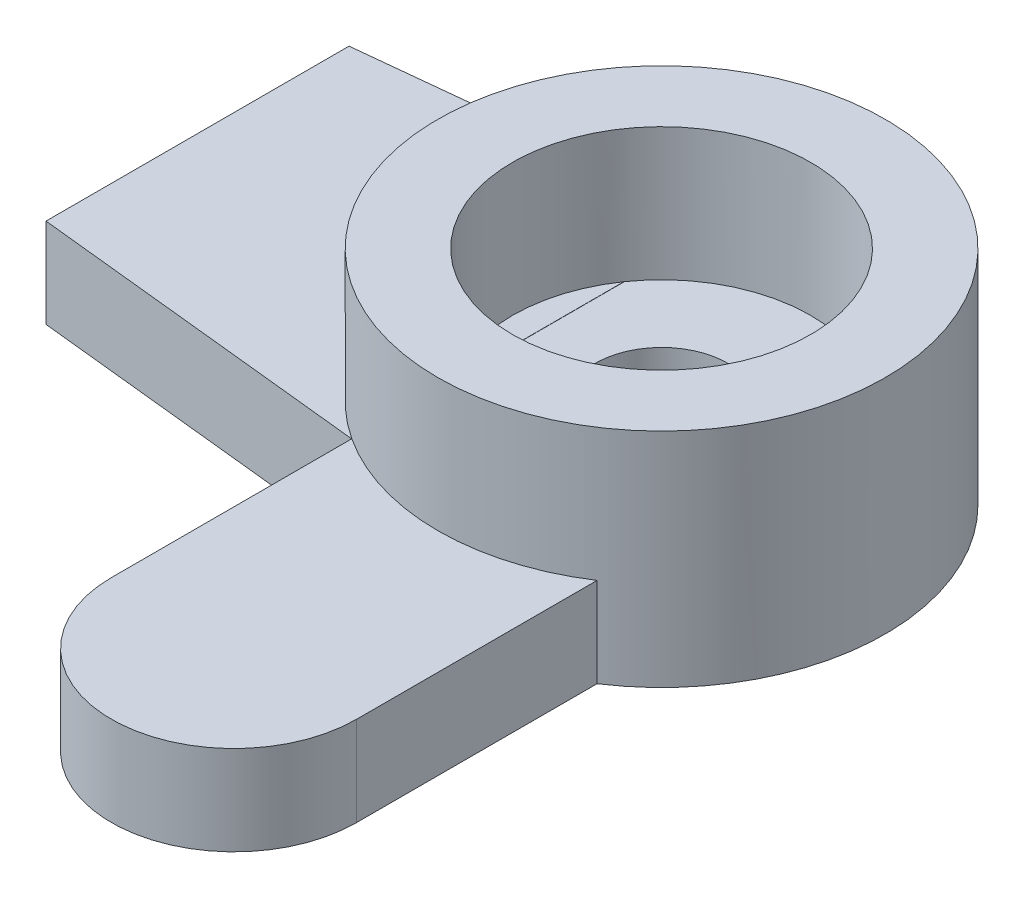
ISO-10303-21;
HEADER;
FILE_DESCRIPTION(('STEP AP214'),'2;1');
FILE_NAME('part.step','',(''),(''),'','','');
FILE_SCHEMA(('AUTOMOTIVE_DESIGN { 1 0 10303 214 1 1 1 1 }'));
ENDSEC;
DATA;
#1=APPLICATION_CONTEXT('core data for automotive mechanical design processes');
#2=APPLICATION_PROTOCOL_DEFINITION('international standard','automotive_design',2000,#1);
#3=PRODUCT_CONTEXT('',#1,'mechanical');
#4=PRODUCT('Part','Part','',(#3));
#5=PRODUCT_RELATED_PRODUCT_CATEGORY('part','',(#4));
#6=PRODUCT_DEFINITION_FORMATION('','',#4);
#7=PRODUCT_DEFINITION_CONTEXT('part definition',#1,'design');
#8=PRODUCT_DEFINITION('design','',#6,#7);
#9=PRODUCT_DEFINITION_SHAPE('','',#8);
#10=(LENGTH_UNIT() NAMED_UNIT(*) SI_UNIT(.MILLI.,.METRE.));
#11=(NAMED_UNIT(*) PLANE_ANGLE_UNIT() SI_UNIT($,.RADIAN.));
#12=(NAMED_UNIT(*) SI_UNIT($,.STERADIAN.) SOLID_ANGLE_UNIT());
#13=UNCERTAINTY_MEASURE_WITH_UNIT(LENGTH_MEASURE(1.E-05),#10,'distance_accuracy_value','');
#14=(GEOMETRIC_REPRESENTATION_CONTEXT(3) GLOBAL_UNCERTAINTY_ASSIGNED_CONTEXT((#13)) GLOBAL_UNIT_ASSIGNED_CONTEXT((#10,
#11,#12)) REPRESENTATION_CONTEXT('',''));
#15=CARTESIAN_POINT('',(0.,0.,0.));
#16=DIRECTION('',(0.,0.,1.));
#17=DIRECTION('',(1.,0.,0.));
#18=AXIS2_PLACEMENT_3D('',#15,#16,#17);
#19=CARTESIAN_POINT('',(-0.312640586171714,1.35,2.98563064108722));
#20=DIRECTION('',(-0.10414565677559,0.,0.994562055467018));
#21=DIRECTION('',(0.994562055467019,0.,0.10414565677559));
#22=AXIS2_PLACEMENT_3D('',#19,#20,#21);
#23=PLANE('',#22);
#24=DIRECTION('',(-0.994562055467019,0.,-0.10414565677559));
#25=VECTOR('',#24,1.);
#26=CARTESIAN_POINT('',(-0.312640586171714,0.,2.98563064108722));
#27=LINE('',#26,#25);
#28=CARTESIAN_POINT('',(-1.85,0.,2.82464590919123));
#29=VERTEX_POINT('',#28);
#30=CARTESIAN_POINT('',(-7.,0.,2.28536318726753));
#31=VERTEX_POINT('',#30);
#32=EDGE_CURVE('E139',#29,#31,#27,.T.);
#33=ORIENTED_EDGE('',*,*,#32,.F.);
#34=DIRECTION('',(0.,-1.,0.));
#35=VECTOR('',#34,1.);
#36=CARTESIAN_POINT('',(-1.85,1.35,2.82464590919123));
#37=LINE('',#36,#35);
#38=CARTESIAN_POINT('',(-1.85,1.35,2.82464590919123));
#39=VERTEX_POINT('',#38);
#40=EDGE_CURVE('E13',#39,#29,#37,.T.);
#41=ORIENTED_EDGE('',*,*,#40,.F.);
#42=DIRECTION('',(-0.994562055467019,0.,-0.10414565677559));
#43=VECTOR('',#42,1.);
#44=CARTESIAN_POINT('',(-0.312640586171714,1.35,2.98563064108722));
#45=LINE('',#44,#43);
#46=CARTESIAN_POINT('',(-7.,1.35,2.28536318726753));
#47=VERTEX_POINT('',#46);
#48=EDGE_CURVE('E124',#39,#47,#45,.T.);
#49=ORIENTED_EDGE('',*,*,#48,.T.);
#50=DIRECTION('',(0.,-1.,0.));
#51=VECTOR('',#50,1.);
#52=CARTESIAN_POINT('',(-7.,1.35,2.28536318726753));
#53=LINE('',#52,#51);
#54=EDGE_CURVE('E92',#47,#31,#53,.T.);
#55=ORIENTED_EDGE('',*,*,#54,.T.);
#56=EDGE_LOOP('',(#33,#41,#49,#55));
#57=FACE_BOUND('',#56,.T.);
#58=ADVANCED_FACE('F76',(#57),#23,.T.);
#59=CARTESIAN_POINT('',(-1.85,1.35,0.));
#60=DIRECTION('',(-1.,0.,0.));
#61=DIRECTION('',(0.,0.,1.));
#62=AXIS2_PLACEMENT_3D('',#59,#60,#61);
#63=PLANE('',#62);
#64=DIRECTION('',(0.,0.,-1.));
#65=VECTOR('',#64,1.);
#66=CARTESIAN_POINT('',(-1.85,0.,0.));
#67=LINE('',#66,#65);
#68=CARTESIAN_POINT('',(-1.85,0.,-2.82464590919123));
#69=VERTEX_POINT('',#68);
#70=EDGE_CURVE('E130',#29,#69,#67,.T.);
#71=ORIENTED_EDGE('',*,*,#70,.T.);
#72=DIRECTION('',(0.,-1.,0.));
#73=VECTOR('',#72,1.);
#74=CARTESIAN_POINT('',(-1.85,1.35,-2.82464590919123));
#75=LINE('',#74,#73);
#76=CARTESIAN_POINT('',(-1.85,1.35,-2.82464590919123));
#77=VERTEX_POINT('',#76);
#78=EDGE_CURVE('E84',#77,#69,#75,.T.);
#79=ORIENTED_EDGE('',*,*,#78,.F.);
#80=DIRECTION('',(0.,0.,-1.));
#81=VECTOR('',#80,1.);
#82=CARTESIAN_POINT('',(-1.85,1.35,0.));
#83=LINE('',#82,#81);
#84=EDGE_CURVE('E118',#39,#77,#83,.T.);
#85=ORIENTED_EDGE('',*,*,#84,.F.);
#86=ORIENTED_EDGE('',*,*,#40,.T.);
#87=EDGE_LOOP('',(#71,#79,#85,#86));
#88=FACE_BOUND('',#87,.T.);
#89=ADVANCED_FACE('F128',(#88),#63,.F.);
#90=CARTESIAN_POINT('',(-0.312640586171714,1.35,-2.98563064108722));
#91=DIRECTION('',(0.10414565677559,0.,0.994562055467018));
#92=DIRECTION('',(0.994562055467019,0.,-0.10414565677559));
#93=AXIS2_PLACEMENT_3D('',#90,#91,#92);
#94=PLANE('',#93);
#95=DIRECTION('',(-0.994562055467019,0.,0.10414565677559));
#96=VECTOR('',#95,1.);
#97=CARTESIAN_POINT('',(-0.312640586171714,0.,-2.98563064108722));
#98=LINE('',#97,#96);
#99=CARTESIAN_POINT('',(-7.,0.,-2.28536318726753));
#100=VERTEX_POINT('',#99);
#101=EDGE_CURVE('E142',#69,#100,#98,.T.);
#102=ORIENTED_EDGE('',*,*,#101,.T.);
#103=DIRECTION('',(0.,-1.,0.));
#104=VECTOR('',#103,1.);
#105=CARTESIAN_POINT('',(-7.,1.35,-2.28536318726753));
#106=LINE('',#105,#104);
#107=CARTESIAN_POINT('',(-7.,1.35,-2.28536318726753));
#108=VERTEX_POINT('',#107);
#109=EDGE_CURVE('E106',#108,#100,#106,.T.);
#110=ORIENTED_EDGE('',*,*,#109,.F.);
#111=DIRECTION('',(-0.994562055467019,0.,0.10414565677559));
#112=VECTOR('',#111,1.);
#113=CARTESIAN_POINT('',(-0.312640586171714,1.35,-2.98563064108722));
#114=LINE('',#113,#112);
#115=EDGE_CURVE('E123',#77,#108,#114,.T.);
#116=ORIENTED_EDGE('',*,*,#115,.F.);
#117=ORIENTED_EDGE('',*,*,#78,.T.);
#118=EDGE_LOOP('',(#102,#110,#116,#117));
#119=FACE_BOUND('',#118,.T.);
#120=ADVANCED_FACE('F133',(#119),#94,.F.);
#121=CARTESIAN_POINT('',(-7.,1.35,0.));
#122=DIRECTION('',(-1.,0.,0.));
#123=DIRECTION('',(0.,0.,1.));
#124=AXIS2_PLACEMENT_3D('',#121,#122,#123);
#125=PLANE('',#124);
#126=DIRECTION('',(0.,0.,-1.));
#127=VECTOR('',#126,1.);
#128=CARTESIAN_POINT('',(-7.,0.,0.));
#129=LINE('',#128,#127);
#130=EDGE_CURVE('E144',#31,#100,#129,.T.);
#131=ORIENTED_EDGE('',*,*,#130,.F.);
#132=ORIENTED_EDGE('',*,*,#54,.F.);
#133=DIRECTION('',(0.,0.,-1.));
#134=VECTOR('',#133,1.);
#135=CARTESIAN_POINT('',(-7.,1.35,0.));
#136=LINE('',#135,#134);
#137=EDGE_CURVE('E134',#47,#108,#136,.T.);
#138=ORIENTED_EDGE('',*,*,#137,.T.);
#139=ORIENTED_EDGE('',*,*,#109,.T.);
#140=EDGE_LOOP('',(#131,#132,#138,#139));
#141=FACE_BOUND('',#140,.T.);
#142=ADVANCED_FACE('F149',(#141),#125,.T.);
#143=CARTESIAN_POINT('',(0.,1.35,0.));
#144=DIRECTION('',(0.,1.,0.));
#145=DIRECTION('',(0.,0.,1.));
#146=AXIS2_PLACEMENT_3D('',#143,#144,#145);
#147=PLANE('',#146);
#148=ORIENTED_EDGE('',*,*,#48,.F.);
#149=ORIENTED_EDGE('',*,*,#84,.T.);
#150=ORIENTED_EDGE('',*,*,#115,.T.);
#151=ORIENTED_EDGE('',*,*,#137,.F.);
#152=EDGE_LOOP('',(#148,#149,#150,#151));
#153=FACE_BOUND('',#152,.T.);
#154=ADVANCED_FACE('F120',(#153),#147,.T.);
#155=CARTESIAN_POINT('',(0.,0.,0.));
#156=DIRECTION('',(0.,1.,0.));
#157=DIRECTION('',(0.,0.,1.));
#158=AXIS2_PLACEMENT_3D('',#155,#156,#157);
#159=PLANE('',#158);
#160=ORIENTED_EDGE('',*,*,#32,.T.);
#161=ORIENTED_EDGE('',*,*,#130,.T.);
#162=ORIENTED_EDGE('',*,*,#101,.F.);
#163=ORIENTED_EDGE('',*,*,#70,.F.);
#164=EDGE_LOOP('',(#160,#161,#162,#163));
#165=FACE_BOUND('',#164,.T.);
#166=ADVANCED_FACE('F156',(#165),#159,.F.);
#167=CLOSED_SHELL('',(#58,#89,#120,#142,#154,#166));
#168=MANIFOLD_SOLID_BREP('B2',#167);
#169=CARTESIAN_POINT('',(1.85,1.35,0.));
#170=DIRECTION('',(-1.,0.,0.));
#171=DIRECTION('',(0.,0.,1.));
#172=AXIS2_PLACEMENT_3D('',#169,#170,#171);
#173=PLANE('',#172);
#174=DIRECTION('',(0.,0.,-1.));
#175=VECTOR('',#174,1.);
#176=CARTESIAN_POINT('',(1.85,0.,0.));
#177=LINE('',#176,#175);
#178=CARTESIAN_POINT('',(1.85,0.,6.45));
#179=VERTEX_POINT('',#178);
#180=CARTESIAN_POINT('',(1.85,0.,2.82278674362765));
#181=VERTEX_POINT('',#180);
#182=EDGE_CURVE('E300',#179,#181,#177,.T.);
#183=ORIENTED_EDGE('',*,*,#182,.T.);
#184=DIRECTION('',(0.,-1.,0.));
#185=VECTOR('',#184,1.);
#186=CARTESIAN_POINT('',(1.85,1.35,2.82278674362765));
#187=LINE('',#186,#185);
#188=CARTESIAN_POINT('',(1.85,1.35,2.82278674362765));
#189=VERTEX_POINT('',#188);
#190=EDGE_CURVE('E208',#189,#181,#187,.T.);
#191=ORIENTED_EDGE('',*,*,#190,.F.);
#192=DIRECTION('',(0.,0.,-1.));
#193=VECTOR('',#192,1.);
#194=CARTESIAN_POINT('',(1.85,1.35,0.));
#195=LINE('',#194,#193);
#196=CARTESIAN_POINT('',(1.85,1.35,6.45));
#197=VERTEX_POINT('',#196);
#198=EDGE_CURVE('E312',#197,#189,#195,.T.);
#199=ORIENTED_EDGE('',*,*,#198,.F.);
#200=DIRECTION('',(0.,-1.,0.));
#201=VECTOR('',#200,1.);
#202=CARTESIAN_POINT('',(1.85,1.35,6.45));
#203=LINE('',#202,#201);
#204=EDGE_CURVE('E296',#197,#179,#203,.T.);
#205=ORIENTED_EDGE('',*,*,#204,.T.);
#206=EDGE_LOOP('',(#183,#191,#199,#205));
#207=FACE_BOUND('',#206,.T.);
#208=ADVANCED_FACE('F205',(#207),#173,.F.);
#209=CARTESIAN_POINT('',(0.,1.35,0.));
#210=DIRECTION('',(0.,-1.,0.));
#211=DIRECTION('',(0.,0.,-1.));
#212=AXIS2_PLACEMENT_3D('',#209,#210,#211);
#213=CYLINDRICAL_SURFACE('',#212,3.375);
#214=CARTESIAN_POINT('',(0.,0.,0.));
#215=DIRECTION('',(0.,1.,0.));
#216=DIRECTION('',(0.,0.,1.));
#217=AXIS2_PLACEMENT_3D('',#214,#215,#216);
#218=CIRCLE('',#217,3.375);
#219=CARTESIAN_POINT('',(-1.84661853126194,0.,-2.825));
#220=VERTEX_POINT('',#219);
#221=EDGE_CURVE('E303',#181,#220,#218,.T.);
#222=ORIENTED_EDGE('',*,*,#221,.T.);
#223=DIRECTION('',(0.,-1.,0.));
#224=VECTOR('',#223,1.);
#225=CARTESIAN_POINT('',(-1.84661853126194,1.35,-2.825));
#226=LINE('',#225,#224);
#227=CARTESIAN_POINT('',(-1.84661853126194,1.35,-2.825));
#228=VERTEX_POINT('',#227);
#229=EDGE_CURVE('E264',#228,#220,#226,.T.);
#230=ORIENTED_EDGE('',*,*,#229,.F.);
#231=CARTESIAN_POINT('',(0.,1.35,0.));
#232=DIRECTION('',(0.,1.,0.));
#233=DIRECTION('',(0.,0.,1.));
#234=AXIS2_PLACEMENT_3D('',#231,#232,#233);
#235=CIRCLE('',#234,3.375);
#236=CARTESIAN_POINT('',(-1.84661853126194,1.35,2.825));
#237=VERTEX_POINT('',#236);
#238=EDGE_CURVE('E214',#228,#237,#235,.T.);
#239=ORIENTED_EDGE('',*,*,#238,.T.);
#240=EDGE_CURVE('E74',#237,#189,#235,.T.);
#241=ORIENTED_EDGE('',*,*,#240,.T.);
#242=ORIENTED_EDGE('',*,*,#190,.T.);
#243=EDGE_LOOP('',(#222,#230,#239,#241,#242));
#244=FACE_BOUND('',#243,.T.);
#245=CARTESIAN_POINT('',(0.,3.35,0.));
#246=DIRECTION('',(0.,1.,0.));
#247=DIRECTION('',(0.,0.,1.));
#248=AXIS2_PLACEMENT_3D('',#245,#246,#247);
#249=CIRCLE('',#248,3.375);
#250=CARTESIAN_POINT('',(0.,3.35,3.375));
#251=VERTEX_POINT('',#250);
#252=EDGE_CURVE('E304',#251,#251,#249,.T.);
#253=ORIENTED_EDGE('',*,*,#252,.F.);
#254=EDGE_LOOP('',(#253));
#255=FACE_BOUND('',#254,.T.);
#256=ADVANCED_FACE('F319',(#244,#255),#213,.T.);
#257=CARTESIAN_POINT('',(-1.84661853126194,1.35,0.));
#258=DIRECTION('',(1.,0.,0.));
#259=DIRECTION('',(0.,0.,-1.));
#260=AXIS2_PLACEMENT_3D('',#257,#258,#259);
#261=PLANE('',#260);
#262=DIRECTION('',(0.,0.,1.));
#263=VECTOR('',#262,1.);
#264=CARTESIAN_POINT('',(-1.84661853126194,0.,0.));
#265=LINE('',#264,#263);
#266=CARTESIAN_POINT('',(-1.84661853126194,0.,2.825));
#267=VERTEX_POINT('',#266);
#268=EDGE_CURVE('E306',#220,#267,#265,.T.);
#269=ORIENTED_EDGE('',*,*,#268,.T.);
#270=DIRECTION('',(0.,-1.,0.));
#271=VECTOR('',#270,1.);
#272=CARTESIAN_POINT('',(-1.84661853126194,1.35,2.825));
#273=LINE('',#272,#271);
#274=EDGE_CURVE('E291',#237,#267,#273,.T.);
#275=ORIENTED_EDGE('',*,*,#274,.F.);
#276=DIRECTION('',(0.,0.,1.));
#277=VECTOR('',#276,1.);
#278=CARTESIAN_POINT('',(-1.84661853126194,1.35,0.));
#279=LINE('',#278,#277);
#280=CARTESIAN_POINT('',(-1.84661853126194,1.35,1.28549601321824));
#281=VERTEX_POINT('',#280);
#282=EDGE_CURVE('E329',#281,#237,#279,.T.);
#283=ORIENTED_EDGE('',*,*,#282,.F.);
#284=CARTESIAN_POINT('',(-1.84661853126194,1.35,-1.28549601321824));
#285=VERTEX_POINT('',#284);
#286=EDGE_CURVE('E331',#285,#281,#279,.T.);
#287=ORIENTED_EDGE('',*,*,#286,.F.);
#288=EDGE_CURVE('E281',#228,#285,#279,.T.);
#289=ORIENTED_EDGE('',*,*,#288,.F.);
#290=ORIENTED_EDGE('',*,*,#229,.T.);
#291=EDGE_LOOP('',(#269,#275,#283,#287,#289,#290));
#292=FACE_BOUND('',#291,.T.);
#293=ADVANCED_FACE('F326',(#292),#261,.F.);
#294=CARTESIAN_POINT('',(-0.312640586171714,1.35,2.98563064108722));
#295=DIRECTION('',(-0.10414565677559,0.,0.994562055467018));
#296=DIRECTION('',(0.994562055467019,0.,0.10414565677559));
#297=AXIS2_PLACEMENT_3D('',#294,#295,#296);
#298=PLANE('',#297);
#299=DIRECTION('',(-0.994562055467019,0.,-0.10414565677559));
#300=VECTOR('',#299,1.);
#301=CARTESIAN_POINT('',(-0.312640586171714,0.,2.98563064108722));
#302=LINE('',#301,#300);
#303=CARTESIAN_POINT('',(-1.85,0.,2.82464590919123));
#304=VERTEX_POINT('',#303);
#305=EDGE_CURVE('E287',#267,#304,#302,.T.);
#306=ORIENTED_EDGE('',*,*,#305,.T.);
#307=DIRECTION('',(0.,-1.,0.));
#308=VECTOR('',#307,1.);
#309=CARTESIAN_POINT('',(-1.85,1.35,2.82464590919123));
#310=LINE('',#309,#308);
#311=CARTESIAN_POINT('',(-1.85,1.35,2.82464590919123));
#312=VERTEX_POINT('',#311);
#313=EDGE_CURVE('E284',#312,#304,#310,.T.);
#314=ORIENTED_EDGE('',*,*,#313,.F.);
#315=DIRECTION('',(-0.994562055467019,0.,-0.10414565677559));
#316=VECTOR('',#315,1.);
#317=CARTESIAN_POINT('',(-0.312640586171714,1.35,2.98563064108722));
#318=LINE('',#317,#316);
#319=EDGE_CURVE('E273',#237,#312,#318,.T.);
#320=ORIENTED_EDGE('',*,*,#319,.F.);
#321=ORIENTED_EDGE('',*,*,#274,.T.);
#322=EDGE_LOOP('',(#306,#314,#320,#321));
#323=FACE_BOUND('',#322,.T.);
#324=ADVANCED_FACE('F285',(#323),#298,.F.);
#325=CARTESIAN_POINT('',(-1.85,1.35,0.));
#326=DIRECTION('',(-1.,0.,0.));
#327=DIRECTION('',(0.,0.,1.));
#328=AXIS2_PLACEMENT_3D('',#325,#326,#327);
#329=PLANE('',#328);
#330=DIRECTION('',(0.,0.,-1.));
#331=VECTOR('',#330,1.);
#332=CARTESIAN_POINT('',(-1.85,0.,0.));
#333=LINE('',#332,#331);
#334=CARTESIAN_POINT('',(-1.85,0.,6.45));
#335=VERTEX_POINT('',#334);
#336=EDGE_CURVE('E309',#335,#304,#333,.T.);
#337=ORIENTED_EDGE('',*,*,#336,.F.);
#338=DIRECTION('',(0.,-1.,0.));
#339=VECTOR('',#338,1.);
#340=CARTESIAN_POINT('',(-1.85,1.35,6.45));
#341=LINE('',#340,#339);
#342=CARTESIAN_POINT('',(-1.85,1.35,6.45));
#343=VERTEX_POINT('',#342);
#344=EDGE_CURVE('E292',#343,#335,#341,.T.);
#345=ORIENTED_EDGE('',*,*,#344,.F.);
#346=DIRECTION('',(0.,0.,-1.));
#347=VECTOR('',#346,1.);
#348=CARTESIAN_POINT('',(-1.85,1.35,0.));
#349=LINE('',#348,#347);
#350=EDGE_CURVE('E277',#343,#312,#349,.T.);
#351=ORIENTED_EDGE('',*,*,#350,.T.);
#352=ORIENTED_EDGE('',*,*,#313,.T.);
#353=EDGE_LOOP('',(#337,#345,#351,#352));
#354=FACE_BOUND('',#353,.T.);
#355=ADVANCED_FACE('F294',(#354),#329,.T.);
#356=CARTESIAN_POINT('',(0.,1.35,6.45));
#357=DIRECTION('',(0.,-1.,0.));
#358=DIRECTION('',(0.,0.,-1.));
#359=AXIS2_PLACEMENT_3D('',#356,#357,#358);
#360=CYLINDRICAL_SURFACE('',#359,1.85);
#361=CARTESIAN_POINT('',(0.,0.,6.45));
#362=DIRECTION('',(0.,1.,0.));
#363=DIRECTION('',(0.,0.,1.));
#364=AXIS2_PLACEMENT_3D('',#361,#362,#363);
#365=CIRCLE('',#364,1.85);
#366=EDGE_CURVE('E256',#335,#179,#365,.T.);
#367=ORIENTED_EDGE('',*,*,#366,.T.);
#368=ORIENTED_EDGE('',*,*,#204,.F.);
#369=CARTESIAN_POINT('',(0.,1.35,6.45));
#370=DIRECTION('',(0.,1.,0.));
#371=DIRECTION('',(0.,0.,1.));
#372=AXIS2_PLACEMENT_3D('',#369,#370,#371);
#373=CIRCLE('',#372,1.85);
#374=EDGE_CURVE('E229',#343,#197,#373,.T.);
#375=ORIENTED_EDGE('',*,*,#374,.F.);
#376=ORIENTED_EDGE('',*,*,#344,.T.);
#377=EDGE_LOOP('',(#367,#368,#375,#376));
#378=FACE_BOUND('',#377,.T.);
#379=ADVANCED_FACE('F367',(#378),#360,.T.);
#380=CARTESIAN_POINT('',(0.,1.35,0.));
#381=DIRECTION('',(0.,1.,0.));
#382=DIRECTION('',(0.,0.,1.));
#383=AXIS2_PLACEMENT_3D('',#380,#381,#382);
#384=PLANE('',#383);
#385=ORIENTED_EDGE('',*,*,#240,.F.);
#386=ORIENTED_EDGE('',*,*,#319,.T.);
#387=ORIENTED_EDGE('',*,*,#350,.F.);
#388=ORIENTED_EDGE('',*,*,#374,.T.);
#389=ORIENTED_EDGE('',*,*,#198,.T.);
#390=EDGE_LOOP('',(#385,#386,#387,#388,#389));
#391=FACE_BOUND('',#390,.T.);
#392=ADVANCED_FACE('F275',(#391),#384,.T.);
#393=CARTESIAN_POINT('',(0.,0.,0.));
#394=DIRECTION('',(0.,1.,0.));
#395=DIRECTION('',(0.,0.,1.));
#396=AXIS2_PLACEMENT_3D('',#393,#394,#395);
#397=PLANE('',#396);
#398=CARTESIAN_POINT('',(0.,0.,0.));
#399=DIRECTION('',(0.,1.,0.));
#400=DIRECTION('',(0.,0.,1.));
#401=AXIS2_PLACEMENT_3D('',#398,#399,#400);
#402=CIRCLE('',#401,1.);
#403=CARTESIAN_POINT('',(0.,0.,1.));
#404=VERTEX_POINT('',#403);
#405=EDGE_CURVE('E351',#404,#404,#402,.T.);
#406=ORIENTED_EDGE('',*,*,#405,.T.);
#407=EDGE_LOOP('',(#406));
#408=FACE_BOUND('',#407,.T.);
#409=ORIENTED_EDGE('',*,*,#182,.F.);
#410=ORIENTED_EDGE('',*,*,#366,.F.);
#411=ORIENTED_EDGE('',*,*,#336,.T.);
#412=ORIENTED_EDGE('',*,*,#305,.F.);
#413=ORIENTED_EDGE('',*,*,#268,.F.);
#414=ORIENTED_EDGE('',*,*,#221,.F.);
#415=EDGE_LOOP('',(#409,#410,#411,#412,#413,#414));
#416=FACE_BOUND('',#415,.T.);
#417=ADVANCED_FACE('F325',(#408,#416),#397,.F.);
#418=CARTESIAN_POINT('',(0.,1.35,0.));
#419=DIRECTION('',(0.,1.,0.));
#420=DIRECTION('',(0.,0.,1.));
#421=AXIS2_PLACEMENT_3D('',#418,#419,#420);
#422=PLANE('',#421);
#423=ORIENTED_EDGE('',*,*,#288,.T.);
#424=CARTESIAN_POINT('',(0.,1.35,0.));
#425=DIRECTION('',(0.,1.,0.));
#426=DIRECTION('',(0.,0.,1.));
#427=AXIS2_PLACEMENT_3D('',#424,#425,#426);
#428=CIRCLE('',#427,2.25);
#429=EDGE_CURVE('E338',#285,#281,#428,.T.);
#430=ORIENTED_EDGE('',*,*,#429,.T.);
#431=ORIENTED_EDGE('',*,*,#282,.T.);
#432=ORIENTED_EDGE('',*,*,#238,.F.);
#433=EDGE_LOOP('',(#423,#430,#431,#432));
#434=FACE_BOUND('',#433,.T.);
#435=ADVANCED_FACE('F337',(#434),#422,.F.);
#436=CARTESIAN_POINT('',(0.,3.35,0.));
#437=DIRECTION('',(0.,1.,0.));
#438=DIRECTION('',(0.,0.,1.));
#439=AXIS2_PLACEMENT_3D('',#436,#437,#438);
#440=PLANE('',#439);
#441=CARTESIAN_POINT('',(0.,3.35,0.));
#442=DIRECTION('',(0.,1.,0.));
#443=DIRECTION('',(0.,0.,1.));
#444=AXIS2_PLACEMENT_3D('',#441,#442,#443);
#445=CIRCLE('',#444,2.25);
#446=CARTESIAN_POINT('',(0.,3.35,2.25));
#447=VERTEX_POINT('',#446);
#448=EDGE_CURVE('E341',#447,#447,#445,.T.);
#449=ORIENTED_EDGE('',*,*,#448,.F.);
#450=EDGE_LOOP('',(#449));
#451=FACE_BOUND('',#450,.T.);
#452=ORIENTED_EDGE('',*,*,#252,.T.);
#453=EDGE_LOOP('',(#452));
#454=FACE_BOUND('',#453,.T.);
#455=ADVANCED_FACE('F355',(#451,#454),#440,.T.);
#456=CARTESIAN_POINT('',(0.,1.35,0.));
#457=DIRECTION('',(0.,1.,0.));
#458=DIRECTION('',(0.,0.,1.));
#459=AXIS2_PLACEMENT_3D('',#456,#457,#458);
#460=PLANE('',#459);
#461=CARTESIAN_POINT('',(0.,1.35,0.));
#462=DIRECTION('',(0.,1.,0.));
#463=DIRECTION('',(0.,0.,1.));
#464=AXIS2_PLACEMENT_3D('',#461,#462,#463);
#465=CIRCLE('',#464,1.);
#466=CARTESIAN_POINT('',(0.,1.35,1.));
#467=VERTEX_POINT('',#466);
#468=EDGE_CURVE('E347',#467,#467,#465,.T.);
#469=ORIENTED_EDGE('',*,*,#468,.F.);
#470=EDGE_LOOP('',(#469));
#471=FACE_BOUND('',#470,.T.);
#472=ORIENTED_EDGE('',*,*,#286,.T.);
#473=EDGE_CURVE('E220',#281,#285,#428,.T.);
#474=ORIENTED_EDGE('',*,*,#473,.T.);
#475=EDGE_LOOP('',(#472,#474));
#476=FACE_BOUND('',#475,.T.);
#477=ADVANCED_FACE('F340',(#471,#476),#460,.T.);
#478=CARTESIAN_POINT('',(0.,1.35,0.));
#479=DIRECTION('',(0.,1.,0.));
#480=DIRECTION('',(0.,0.,1.));
#481=AXIS2_PLACEMENT_3D('',#478,#479,#480);
#482=CYLINDRICAL_SURFACE('',#481,2.25);
#483=ORIENTED_EDGE('',*,*,#429,.F.);
#484=ORIENTED_EDGE('',*,*,#473,.F.);
#485=EDGE_LOOP('',(#483,#484));
#486=FACE_BOUND('',#485,.T.);
#487=ORIENTED_EDGE('',*,*,#448,.T.);
#488=EDGE_LOOP('',(#487));
#489=FACE_BOUND('',#488,.T.);
#490=ADVANCED_FACE('F343',(#486,#489),#482,.F.);
#491=CARTESIAN_POINT('',(0.,0.,0.));
#492=DIRECTION('',(0.,1.,0.));
#493=DIRECTION('',(0.,0.,1.));
#494=AXIS2_PLACEMENT_3D('',#491,#492,#493);
#495=CYLINDRICAL_SURFACE('',#494,1.);
#496=CARTESIAN_POINT('',(0.,0.,1.));
#497=CARTESIAN_POINT('',(0.,0.0140625,1.));
#498=CARTESIAN_POINT('',(0.,0.028125,1.));
#499=CARTESIAN_POINT('',(0.,0.05625,1.));
#500=CARTESIAN_POINT('',(0.,0.0703125,1.));
#501=CARTESIAN_POINT('',(0.,0.0984375,1.));
#502=CARTESIAN_POINT('',(0.,0.1125,1.));
#503=CARTESIAN_POINT('',(0.,0.140625,1.));
#504=CARTESIAN_POINT('',(0.,0.1546875,1.));
#505=CARTESIAN_POINT('',(0.,0.1828125,1.));
#506=CARTESIAN_POINT('',(0.,0.196875,1.));
#507=CARTESIAN_POINT('',(0.,0.225,1.));
#508=CARTESIAN_POINT('',(0.,0.2390625,1.));
#509=CARTESIAN_POINT('',(0.,0.2671875,1.));
#510=CARTESIAN_POINT('',(0.,0.28125,1.));
#511=CARTESIAN_POINT('',(0.,0.309375,1.));
#512=CARTESIAN_POINT('',(0.,0.3234375,1.));
#513=CARTESIAN_POINT('',(0.,0.3515625,1.));
#514=CARTESIAN_POINT('',(0.,0.365625,1.));
#515=CARTESIAN_POINT('',(0.,0.39375,1.));
#516=CARTESIAN_POINT('',(0.,0.4078125,1.));
#517=CARTESIAN_POINT('',(0.,0.4359375,1.));
#518=CARTESIAN_POINT('',(0.,0.45,1.));
#519=CARTESIAN_POINT('',(0.,0.478125,1.));
#520=CARTESIAN_POINT('',(0.,0.4921875,1.));
#521=CARTESIAN_POINT('',(0.,0.5203125,1.));
#522=CARTESIAN_POINT('',(0.,0.534375,1.));
#523=CARTESIAN_POINT('',(0.,0.5625,1.));
#524=CARTESIAN_POINT('',(0.,0.5765625,1.));
#525=CARTESIAN_POINT('',(0.,0.6046875,1.));
#526=CARTESIAN_POINT('',(0.,0.61875,1.));
#527=CARTESIAN_POINT('',(0.,0.646875,1.));
#528=CARTESIAN_POINT('',(0.,0.6609375,1.));
#529=CARTESIAN_POINT('',(0.,0.6890625,1.));
#530=CARTESIAN_POINT('',(0.,0.703125,1.));
#531=CARTESIAN_POINT('',(0.,0.73125,1.));
#532=CARTESIAN_POINT('',(0.,0.7453125,1.));
#533=CARTESIAN_POINT('',(0.,0.7734375,1.));
#534=CARTESIAN_POINT('',(0.,0.7875,1.));
#535=CARTESIAN_POINT('',(0.,0.815625,1.));
#536=CARTESIAN_POINT('',(0.,0.8296875,1.));
#537=CARTESIAN_POINT('',(0.,0.8578125,1.));
#538=CARTESIAN_POINT('',(0.,0.871875,1.));
#539=CARTESIAN_POINT('',(0.,0.9,1.));
#540=CARTESIAN_POINT('',(0.,0.9140625,1.));
#541=CARTESIAN_POINT('',(0.,0.9421875,1.));
#542=CARTESIAN_POINT('',(0.,0.95625,1.));
#543=CARTESIAN_POINT('',(0.,0.984375,1.));
#544=CARTESIAN_POINT('',(0.,0.9984375,1.));
#545=CARTESIAN_POINT('',(0.,1.0265625,1.));
#546=CARTESIAN_POINT('',(0.,1.040625,1.));
#547=CARTESIAN_POINT('',(0.,1.06875,1.));
#548=CARTESIAN_POINT('',(0.,1.0828125,1.));
#549=CARTESIAN_POINT('',(0.,1.1109375,1.));
#550=CARTESIAN_POINT('',(0.,1.125,1.));
#551=CARTESIAN_POINT('',(0.,1.153125,1.));
#552=CARTESIAN_POINT('',(0.,1.1671875,1.));
#553=CARTESIAN_POINT('',(0.,1.1953125,1.));
#554=CARTESIAN_POINT('',(0.,1.209375,1.));
#555=CARTESIAN_POINT('',(0.,1.2375,1.));
#556=CARTESIAN_POINT('',(0.,1.2515625,1.));
#557=CARTESIAN_POINT('',(0.,1.2796875,1.));
#558=CARTESIAN_POINT('',(0.,1.29375,1.));
#559=CARTESIAN_POINT('',(0.,1.321875,1.));
#560=CARTESIAN_POINT('',(0.,1.3359375,1.));
#561=CARTESIAN_POINT('',(0.,1.35,1.));
#562=B_SPLINE_CURVE_WITH_KNOTS('',3,(#496,#497,#498,#499,#500,#501,#502,#503,#504,#505,#506,
#507,#508,#509,#510,#511,#512,#513,#514,#515,#516,#517,#518,#519,#520,#521,#522,#523,#524,#525,
#526,#527,#528,#529,#530,#531,#532,#533,#534,#535,#536,#537,#538,#539,#540,#541,#542,#543,#544,
#545,#546,#547,#548,#549,#550,#551,#552,#553,#554,#555,#556,#557,#558,#559,#560,#561),
.UNSPECIFIED.,.F.,.F.,(4,2,2,2,2,2,2,2,2,2,2,2,2,2,2,2,2,2,2,2,2,2,2,2,2,2,2,2,2,2,2,2,4),(0.,
0.0421875,0.084375,0.1265625,0.16875,0.2109375,0.253125,0.2953125,0.3375,0.3796875,0.421875,
0.4640625,0.50625,0.5484375,0.590625,0.6328125,0.675,0.7171875,0.759375,0.8015625,0.84375,
0.8859375,0.928125,0.9703125,1.0125,1.0546875,1.096875,1.1390625,1.18125,1.2234375,1.265625,
1.3078125,1.35),.UNSPECIFIED.);
#563=EDGE_CURVE('BSEAM382',#404,#467,#562,.T.);
#564=ORIENTED_EDGE('',*,*,#405,.F.);
#565=ORIENTED_EDGE('',*,*,#468,.T.);
#566=ORIENTED_EDGE('',*,*,#563,.T.);
#567=ORIENTED_EDGE('',*,*,#563,.F.);
#568=EDGE_LOOP('',(#564,#566,#565,#567));
#569=FACE_BOUND('',#568,.T.);
#570=ADVANCED_FACE('F382',(#569),#495,.F.);
#571=CLOSED_SHELL('',(#208,#256,#293,#324,#355,#379,#392,#417,#435,#455,#477,#490,#570));
#572=MANIFOLD_SOLID_BREP('B7',#571);
#573=ADVANCED_BREP_SHAPE_REPRESENTATION('',(#18,#168,#572),#14);
#574=SHAPE_DEFINITION_REPRESENTATION(#9,#573);
ENDSEC;
END-ISO-10303-21;
